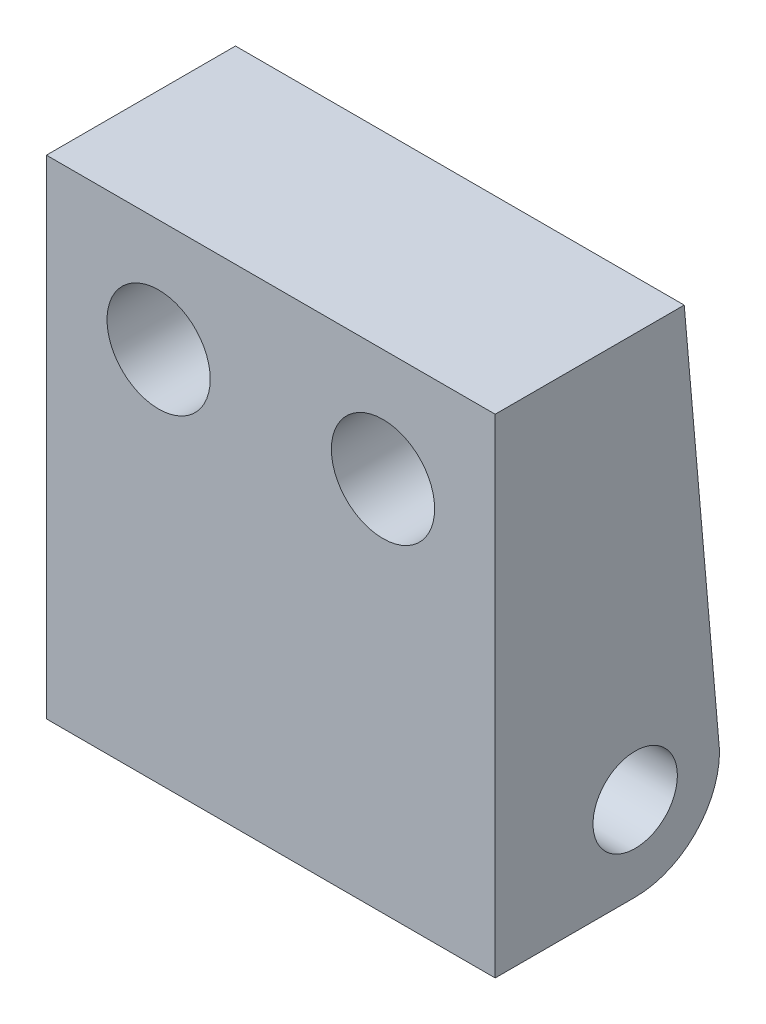
ISO-10303-21;
HEADER;
FILE_DESCRIPTION(('STEP AP214'),'2;1');
FILE_NAME('part.step','',(''),(''),'','','');
FILE_SCHEMA(('AUTOMOTIVE_DESIGN { 1 0 10303 214 1 1 1 1 }'));
ENDSEC;
DATA;
#1=APPLICATION_CONTEXT('core data for automotive mechanical design processes');
#2=APPLICATION_PROTOCOL_DEFINITION('international standard','automotive_design',2000,#1);
#3=PRODUCT_CONTEXT('',#1,'mechanical');
#4=PRODUCT('Part','Part','',(#3));
#5=PRODUCT_RELATED_PRODUCT_CATEGORY('part','',(#4));
#6=PRODUCT_DEFINITION_FORMATION('','',#4);
#7=PRODUCT_DEFINITION_CONTEXT('part definition',#1,'design');
#8=PRODUCT_DEFINITION('design','',#6,#7);
#9=PRODUCT_DEFINITION_SHAPE('','',#8);
#10=(LENGTH_UNIT() NAMED_UNIT(*) SI_UNIT(.MILLI.,.METRE.));
#11=(NAMED_UNIT(*) PLANE_ANGLE_UNIT() SI_UNIT($,.RADIAN.));
#12=(NAMED_UNIT(*) SI_UNIT($,.STERADIAN.) SOLID_ANGLE_UNIT());
#13=UNCERTAINTY_MEASURE_WITH_UNIT(LENGTH_MEASURE(1.E-05),#10,'distance_accuracy_value','');
#14=(GEOMETRIC_REPRESENTATION_CONTEXT(3) GLOBAL_UNCERTAINTY_ASSIGNED_CONTEXT((#13)) GLOBAL_UNIT_ASSIGNED_CONTEXT((#10,
#11,#12)) REPRESENTATION_CONTEXT('',''));
#15=CARTESIAN_POINT('',(0.,0.,0.));
#16=DIRECTION('',(0.,0.,1.));
#17=DIRECTION('',(1.,0.,0.));
#18=AXIS2_PLACEMENT_3D('',#15,#16,#17);
#19=CARTESIAN_POINT('',(0.,0.,6.35));
#20=DIRECTION('',(1.,0.,0.));
#21=DIRECTION('',(0.,0.,-1.));
#22=AXIS2_PLACEMENT_3D('',#19,#20,#21);
#23=PLANE('',#22);
#24=CARTESIAN_POINT('',(0.,2.3876,2.3876));
#25=DIRECTION('',(1.,0.,0.));
#26=DIRECTION('',(0.,0.,-1.));
#27=AXIS2_PLACEMENT_3D('',#24,#25,#26);
#28=CIRCLE('',#27,1.1938);
#29=CARTESIAN_POINT('',(0.,2.3876,1.1938));
#30=VERTEX_POINT('',#29);
#31=EDGE_CURVE('E111',#30,#30,#28,.T.);
#32=ORIENTED_EDGE('',*,*,#31,.T.);
#33=EDGE_LOOP('',(#32));
#34=FACE_BOUND('',#33,.T.);
#35=DIRECTION('',(0.,0.,-1.));
#36=VECTOR('',#35,1.);
#37=CARTESIAN_POINT('',(0.,13.8176,6.35));
#38=LINE('',#37,#36);
#39=CARTESIAN_POINT('',(0.,13.8176,6.35));
#40=VERTEX_POINT('',#39);
#41=CARTESIAN_POINT('',(0.,13.8176,0.999995424101237));
#42=VERTEX_POINT('',#41);
#43=EDGE_CURVE('E99',#40,#42,#38,.T.);
#44=ORIENTED_EDGE('',*,*,#43,.T.);
#45=DIRECTION('',(0.,-0.996194698091746,-0.0871557427476517));
#46=VECTOR('',#45,1.);
#47=CARTESIAN_POINT('',(0.,2.3876,0.));
#48=LINE('',#47,#46);
#49=CARTESIAN_POINT('',(0.,2.3876,0.));
#50=VERTEX_POINT('',#49);
#51=EDGE_CURVE('E83',#42,#50,#48,.T.);
#52=ORIENTED_EDGE('',*,*,#51,.T.);
#53=CARTESIAN_POINT('',(0.,2.3876,2.3876));
#54=DIRECTION('',(-1.,0.,0.));
#55=DIRECTION('',(0.,0.,-1.));
#56=AXIS2_PLACEMENT_3D('',#53,#54,#55);
#57=CIRCLE('',#56,2.3876);
#58=CARTESIAN_POINT('',(0.,0.,2.3876));
#59=VERTEX_POINT('',#58);
#60=EDGE_CURVE('E97',#50,#59,#57,.T.);
#61=ORIENTED_EDGE('',*,*,#60,.T.);
#62=DIRECTION('',(0.,0.,-1.));
#63=VECTOR('',#62,1.);
#64=CARTESIAN_POINT('',(0.,0.,6.35));
#65=LINE('',#64,#63);
#66=CARTESIAN_POINT('',(0.,0.,6.35));
#67=VERTEX_POINT('',#66);
#68=EDGE_CURVE('E11',#67,#59,#65,.T.);
#69=ORIENTED_EDGE('',*,*,#68,.F.);
#70=DIRECTION('',(0.,-1.,0.));
#71=VECTOR('',#70,1.);
#72=CARTESIAN_POINT('',(0.,0.,6.35));
#73=LINE('',#72,#71);
#74=EDGE_CURVE('E114',#40,#67,#73,.T.);
#75=ORIENTED_EDGE('',*,*,#74,.F.);
#76=EDGE_LOOP('',(#44,#52,#61,#69,#75));
#77=FACE_BOUND('',#76,.T.);
#78=ADVANCED_FACE('F33',(#34,#77),#23,.F.);
#79=CARTESIAN_POINT('',(0.,0.,6.35));
#80=DIRECTION('',(0.,1.,0.));
#81=DIRECTION('',(0.,0.,1.));
#82=AXIS2_PLACEMENT_3D('',#79,#80,#81);
#83=PLANE('',#82);
#84=ORIENTED_EDGE('',*,*,#68,.T.);
#85=DIRECTION('',(1.,0.,0.));
#86=VECTOR('',#85,1.);
#87=CARTESIAN_POINT('',(0.,0.,2.3876));
#88=LINE('',#87,#86);
#89=CARTESIAN_POINT('',(12.7,0.,2.3876));
#90=VERTEX_POINT('',#89);
#91=EDGE_CURVE('E91',#59,#90,#88,.T.);
#92=ORIENTED_EDGE('',*,*,#91,.T.);
#93=DIRECTION('',(0.,0.,-1.));
#94=VECTOR('',#93,1.);
#95=CARTESIAN_POINT('',(12.7,0.,6.35));
#96=LINE('',#95,#94);
#97=CARTESIAN_POINT('',(12.7,0.,6.35));
#98=VERTEX_POINT('',#97);
#99=EDGE_CURVE('E41',#98,#90,#96,.T.);
#100=ORIENTED_EDGE('',*,*,#99,.F.);
#101=DIRECTION('',(1.,0.,0.));
#102=VECTOR('',#101,1.);
#103=CARTESIAN_POINT('',(0.,0.,6.35));
#104=LINE('',#103,#102);
#105=EDGE_CURVE('E118',#67,#98,#104,.T.);
#106=ORIENTED_EDGE('',*,*,#105,.F.);
#107=EDGE_LOOP('',(#84,#92,#100,#106));
#108=FACE_BOUND('',#107,.T.);
#109=ADVANCED_FACE('F164',(#108),#83,.F.);
#110=CARTESIAN_POINT('',(12.7,0.,6.35));
#111=DIRECTION('',(-1.,0.,0.));
#112=DIRECTION('',(0.,0.,1.));
#113=AXIS2_PLACEMENT_3D('',#110,#111,#112);
#114=PLANE('',#113);
#115=CARTESIAN_POINT('',(12.7,2.3876,2.3876));
#116=DIRECTION('',(1.,0.,0.));
#117=DIRECTION('',(0.,0.,-1.));
#118=AXIS2_PLACEMENT_3D('',#115,#116,#117);
#119=CIRCLE('',#118,1.1938);
#120=CARTESIAN_POINT('',(12.7,2.3876,1.1938));
#121=VERTEX_POINT('',#120);
#122=EDGE_CURVE('E90',#121,#121,#119,.T.);
#123=ORIENTED_EDGE('',*,*,#122,.F.);
#124=EDGE_LOOP('',(#123));
#125=FACE_BOUND('',#124,.T.);
#126=CARTESIAN_POINT('',(12.7,2.3876,2.3876));
#127=DIRECTION('',(-1.,0.,0.));
#128=DIRECTION('',(0.,0.,-1.));
#129=AXIS2_PLACEMENT_3D('',#126,#127,#128);
#130=CIRCLE('',#129,2.3876);
#131=CARTESIAN_POINT('',(12.7,2.3876,0.));
#132=VERTEX_POINT('',#131);
#133=EDGE_CURVE('E104',#132,#90,#130,.T.);
#134=ORIENTED_EDGE('',*,*,#133,.F.);
#135=DIRECTION('',(0.,-0.996194698091746,-0.0871557427476517));
#136=VECTOR('',#135,1.);
#137=CARTESIAN_POINT('',(12.7,2.3876,0.));
#138=LINE('',#137,#136);
#139=CARTESIAN_POINT('',(12.7,13.8176,0.999995424101237));
#140=VERTEX_POINT('',#139);
#141=EDGE_CURVE('E86',#140,#132,#138,.T.);
#142=ORIENTED_EDGE('',*,*,#141,.F.);
#143=DIRECTION('',(0.,0.,-1.));
#144=VECTOR('',#143,1.);
#145=CARTESIAN_POINT('',(12.7,13.8176,6.35));
#146=LINE('',#145,#144);
#147=CARTESIAN_POINT('',(12.7,13.8176,6.35));
#148=VERTEX_POINT('',#147);
#149=EDGE_CURVE('E123',#148,#140,#146,.T.);
#150=ORIENTED_EDGE('',*,*,#149,.F.);
#151=DIRECTION('',(0.,1.,0.));
#152=VECTOR('',#151,1.);
#153=CARTESIAN_POINT('',(12.7,0.,6.35));
#154=LINE('',#153,#152);
#155=EDGE_CURVE('E54',#98,#148,#154,.T.);
#156=ORIENTED_EDGE('',*,*,#155,.F.);
#157=ORIENTED_EDGE('',*,*,#99,.T.);
#158=EDGE_LOOP('',(#134,#142,#150,#156,#157));
#159=FACE_BOUND('',#158,.T.);
#160=ADVANCED_FACE('F166',(#125,#159),#114,.F.);
#161=CARTESIAN_POINT('',(0.,13.8176,6.35));
#162=DIRECTION('',(0.,-1.,0.));
#163=DIRECTION('',(0.,0.,-1.));
#164=AXIS2_PLACEMENT_3D('',#161,#162,#163);
#165=PLANE('',#164);
#166=ORIENTED_EDGE('',*,*,#149,.T.);
#167=DIRECTION('',(-1.,0.,0.));
#168=VECTOR('',#167,1.);
#169=CARTESIAN_POINT('',(0.,13.8176,0.999995424101236));
#170=LINE('',#169,#168);
#171=EDGE_CURVE('E100',#140,#42,#170,.T.);
#172=ORIENTED_EDGE('',*,*,#171,.T.);
#173=ORIENTED_EDGE('',*,*,#43,.F.);
#174=DIRECTION('',(-1.,0.,0.));
#175=VECTOR('',#174,1.);
#176=CARTESIAN_POINT('',(0.,13.8176,6.35));
#177=LINE('',#176,#175);
#178=EDGE_CURVE('E49',#148,#40,#177,.T.);
#179=ORIENTED_EDGE('',*,*,#178,.F.);
#180=EDGE_LOOP('',(#166,#172,#173,#179));
#181=FACE_BOUND('',#180,.T.);
#182=ADVANCED_FACE('F159',(#181),#165,.F.);
#183=CARTESIAN_POINT('',(0.,0.,6.35));
#184=DIRECTION('',(0.,0.,-1.));
#185=DIRECTION('',(-1.,0.,0.));
#186=AXIS2_PLACEMENT_3D('',#183,#184,#185);
#187=PLANE('',#186);
#188=CARTESIAN_POINT('',(9.525,10.6426,6.35));
#189=DIRECTION('',(0.,0.,1.));
#190=DIRECTION('',(-1.,0.,0.));
#191=AXIS2_PLACEMENT_3D('',#188,#189,#190);
#192=CIRCLE('',#191,1.4605);
#193=CARTESIAN_POINT('',(8.0645,10.6426,6.35));
#194=VERTEX_POINT('',#193);
#195=EDGE_CURVE('E134',#194,#194,#192,.T.);
#196=ORIENTED_EDGE('',*,*,#195,.F.);
#197=EDGE_LOOP('',(#196));
#198=FACE_BOUND('',#197,.T.);
#199=CARTESIAN_POINT('',(3.175,10.6426,6.35));
#200=DIRECTION('',(0.,0.,1.));
#201=DIRECTION('',(1.,0.,0.));
#202=AXIS2_PLACEMENT_3D('',#199,#200,#201);
#203=CIRCLE('',#202,1.4605);
#204=CARTESIAN_POINT('',(4.6355,10.6426,6.35));
#205=VERTEX_POINT('',#204);
#206=EDGE_CURVE('E150',#205,#205,#203,.T.);
#207=ORIENTED_EDGE('',*,*,#206,.F.);
#208=EDGE_LOOP('',(#207));
#209=FACE_BOUND('',#208,.T.);
#210=ORIENTED_EDGE('',*,*,#74,.T.);
#211=ORIENTED_EDGE('',*,*,#105,.T.);
#212=ORIENTED_EDGE('',*,*,#155,.T.);
#213=ORIENTED_EDGE('',*,*,#178,.T.);
#214=EDGE_LOOP('',(#210,#211,#212,#213));
#215=FACE_BOUND('',#214,.T.);
#216=ADVANCED_FACE('F156',(#198,#209,#215),#187,.F.);
#217=CARTESIAN_POINT('',(0.,2.3876,2.3876));
#218=DIRECTION('',(1.,0.,0.));
#219=DIRECTION('',(0.,0.,-1.));
#220=AXIS2_PLACEMENT_3D('',#217,#218,#219);
#221=CYLINDRICAL_SURFACE('',#220,1.1938);
#222=ORIENTED_EDGE('',*,*,#31,.F.);
#223=EDGE_LOOP('',(#222));
#224=FACE_BOUND('',#223,.T.);
#225=ORIENTED_EDGE('',*,*,#122,.T.);
#226=EDGE_LOOP('',(#225));
#227=FACE_BOUND('',#226,.T.);
#228=ADVANCED_FACE('F158',(#224,#227),#221,.F.);
#229=CARTESIAN_POINT('',(0.,2.3876,2.3876));
#230=DIRECTION('',(1.,0.,0.));
#231=DIRECTION('',(0.,0.,-1.));
#232=AXIS2_PLACEMENT_3D('',#229,#230,#231);
#233=CYLINDRICAL_SURFACE('',#232,2.3876);
#234=ORIENTED_EDGE('',*,*,#133,.T.);
#235=ORIENTED_EDGE('',*,*,#91,.F.);
#236=ORIENTED_EDGE('',*,*,#60,.F.);
#237=DIRECTION('',(1.,0.,0.));
#238=VECTOR('',#237,1.);
#239=CARTESIAN_POINT('',(0.,2.3876,0.));
#240=LINE('',#239,#238);
#241=EDGE_CURVE('E80',#50,#132,#240,.T.);
#242=ORIENTED_EDGE('',*,*,#241,.T.);
#243=EDGE_LOOP('',(#234,#235,#236,#242));
#244=FACE_BOUND('',#243,.T.);
#245=ADVANCED_FACE('F102',(#244),#233,.T.);
#246=CARTESIAN_POINT('',(0.,2.3876,0.));
#247=DIRECTION('',(0.,-0.0871557427476517,0.996194698091746));
#248=DIRECTION('',(0.,-0.996194698091746,-0.0871557427476517));
#249=AXIS2_PLACEMENT_3D('',#246,#247,#248);
#250=PLANE('',#249);
#251=CARTESIAN_POINT('',(9.525,10.6426,0.722218917406449));
#252=DIRECTION('',(0.,-0.0871557427476517,0.996194698091746));
#253=DIRECTION('',(0.,0.996194698091746,0.0871557427476517));
#254=AXIS2_PLACEMENT_3D('',#251,#252,#253);
#255=ELLIPSE('',#254,2.79192411415931,2.7813);
#256=CARTESIAN_POINT('',(9.525,13.4239,0.965551137271083));
#257=VERTEX_POINT('',#256);
#258=EDGE_CURVE('E36',#257,#257,#255,.T.);
#259=ORIENTED_EDGE('',*,*,#258,.T.);
#260=EDGE_LOOP('',(#259));
#261=FACE_BOUND('',#260,.T.);
#262=CARTESIAN_POINT('',(3.175,10.6426,0.722218917406449));
#263=DIRECTION('',(0.,-0.0871557427476517,0.996194698091746));
#264=DIRECTION('',(0.,0.996194698091746,0.0871557427476517));
#265=AXIS2_PLACEMENT_3D('',#262,#263,#264);
#266=ELLIPSE('',#265,2.79192411415931,2.7813);
#267=CARTESIAN_POINT('',(3.175,13.4239,0.965551137271083));
#268=VERTEX_POINT('',#267);
#269=EDGE_CURVE('E131',#268,#268,#266,.T.);
#270=ORIENTED_EDGE('',*,*,#269,.T.);
#271=EDGE_LOOP('',(#270));
#272=FACE_BOUND('',#271,.T.);
#273=ORIENTED_EDGE('',*,*,#141,.T.);
#274=ORIENTED_EDGE('',*,*,#241,.F.);
#275=ORIENTED_EDGE('',*,*,#51,.F.);
#276=ORIENTED_EDGE('',*,*,#171,.F.);
#277=EDGE_LOOP('',(#273,#274,#275,#276));
#278=FACE_BOUND('',#277,.T.);
#279=ADVANCED_FACE('F82',(#261,#272,#278),#250,.F.);
#280=CARTESIAN_POINT('',(3.175,10.6426,0.));
#281=DIRECTION('',(0.,0.,1.));
#282=DIRECTION('',(1.,0.,0.));
#283=AXIS2_PLACEMENT_3D('',#280,#281,#282);
#284=CYLINDRICAL_SURFACE('',#283,1.4605);
#285=CARTESIAN_POINT('',(3.175,10.6426,1.27));
#286=DIRECTION('',(0.,0.,1.));
#287=DIRECTION('',(1.,0.,0.));
#288=AXIS2_PLACEMENT_3D('',#285,#286,#287);
#289=CIRCLE('',#288,1.4605);
#290=CARTESIAN_POINT('',(4.6355,10.6426,1.27));
#291=VERTEX_POINT('',#290);
#292=EDGE_CURVE('E128',#291,#291,#289,.F.);
#293=ORIENTED_EDGE('',*,*,#292,.T.);
#294=EDGE_LOOP('',(#293));
#295=FACE_BOUND('',#294,.T.);
#296=ORIENTED_EDGE('',*,*,#206,.T.);
#297=EDGE_LOOP('',(#296));
#298=FACE_BOUND('',#297,.T.);
#299=ADVANCED_FACE('F154',(#295,#298),#284,.F.);
#300=CARTESIAN_POINT('',(9.525,10.6426,0.));
#301=DIRECTION('',(0.,0.,1.));
#302=DIRECTION('',(1.,0.,0.));
#303=AXIS2_PLACEMENT_3D('',#300,#301,#302);
#304=CYLINDRICAL_SURFACE('',#303,1.4605);
#305=CARTESIAN_POINT('',(9.525,10.6426,1.27));
#306=DIRECTION('',(0.,0.,1.));
#307=DIRECTION('',(1.,0.,0.));
#308=AXIS2_PLACEMENT_3D('',#305,#306,#307);
#309=CIRCLE('',#308,1.4605);
#310=CARTESIAN_POINT('',(10.9855,10.6426,1.27));
#311=VERTEX_POINT('',#310);
#312=EDGE_CURVE('E135',#311,#311,#309,.F.);
#313=ORIENTED_EDGE('',*,*,#312,.T.);
#314=EDGE_LOOP('',(#313));
#315=FACE_BOUND('',#314,.T.);
#316=ORIENTED_EDGE('',*,*,#195,.T.);
#317=EDGE_LOOP('',(#316));
#318=FACE_BOUND('',#317,.T.);
#319=ADVANCED_FACE('F196',(#315,#318),#304,.F.);
#320=CARTESIAN_POINT('',(3.175,10.6426,0.));
#321=DIRECTION('',(0.,0.,1.));
#322=DIRECTION('',(1.,0.,0.));
#323=AXIS2_PLACEMENT_3D('',#320,#321,#322);
#324=CYLINDRICAL_SURFACE('',#323,2.7813);
#325=CARTESIAN_POINT('',(3.175,10.6426,1.27));
#326=DIRECTION('',(0.,0.,1.));
#327=DIRECTION('',(1.,0.,0.));
#328=AXIS2_PLACEMENT_3D('',#325,#326,#327);
#329=CIRCLE('',#328,2.7813);
#330=CARTESIAN_POINT('',(5.9563,10.6426,1.27));
#331=VERTEX_POINT('',#330);
#332=EDGE_CURVE('E132',#331,#331,#329,.T.);
#333=ORIENTED_EDGE('',*,*,#332,.T.);
#334=EDGE_LOOP('',(#333));
#335=FACE_BOUND('',#334,.T.);
#336=ORIENTED_EDGE('',*,*,#269,.F.);
#337=EDGE_LOOP('',(#336));
#338=FACE_BOUND('',#337,.T.);
#339=ADVANCED_FACE('F200',(#335,#338),#324,.F.);
#340=CARTESIAN_POINT('',(3.175,10.6426,1.27));
#341=DIRECTION('',(0.,0.,1.));
#342=DIRECTION('',(1.,0.,0.));
#343=AXIS2_PLACEMENT_3D('',#340,#341,#342);
#344=PLANE('',#343);
#345=ORIENTED_EDGE('',*,*,#332,.F.);
#346=EDGE_LOOP('',(#345));
#347=FACE_BOUND('',#346,.T.);
#348=ORIENTED_EDGE('',*,*,#292,.F.);
#349=EDGE_LOOP('',(#348));
#350=FACE_BOUND('',#349,.T.);
#351=ADVANCED_FACE('F203',(#347,#350),#344,.F.);
#352=CARTESIAN_POINT('',(9.525,10.6426,0.));
#353=DIRECTION('',(0.,0.,1.));
#354=DIRECTION('',(1.,0.,0.));
#355=AXIS2_PLACEMENT_3D('',#352,#353,#354);
#356=CYLINDRICAL_SURFACE('',#355,2.7813);
#357=CARTESIAN_POINT('',(9.525,10.6426,1.27));
#358=DIRECTION('',(0.,0.,1.));
#359=DIRECTION('',(1.,0.,0.));
#360=AXIS2_PLACEMENT_3D('',#357,#358,#359);
#361=CIRCLE('',#360,2.7813);
#362=CARTESIAN_POINT('',(12.3063,10.6426,1.27));
#363=VERTEX_POINT('',#362);
#364=EDGE_CURVE('E137',#363,#363,#361,.T.);
#365=ORIENTED_EDGE('',*,*,#364,.T.);
#366=EDGE_LOOP('',(#365));
#367=FACE_BOUND('',#366,.T.);
#368=ORIENTED_EDGE('',*,*,#258,.F.);
#369=EDGE_LOOP('',(#368));
#370=FACE_BOUND('',#369,.T.);
#371=ADVANCED_FACE('F207',(#367,#370),#356,.F.);
#372=CARTESIAN_POINT('',(9.525,10.6426,1.27));
#373=DIRECTION('',(0.,0.,1.));
#374=DIRECTION('',(1.,0.,0.));
#375=AXIS2_PLACEMENT_3D('',#372,#373,#374);
#376=PLANE('',#375);
#377=ORIENTED_EDGE('',*,*,#364,.F.);
#378=EDGE_LOOP('',(#377));
#379=FACE_BOUND('',#378,.T.);
#380=ORIENTED_EDGE('',*,*,#312,.F.);
#381=EDGE_LOOP('',(#380));
#382=FACE_BOUND('',#381,.T.);
#383=ADVANCED_FACE('F211',(#379,#382),#376,.F.);
#384=CLOSED_SHELL('',(#78,#109,#160,#182,#216,#228,#245,#279,#299,#319,#339,#351,#371,#383));
#385=MANIFOLD_SOLID_BREP('B2',#384);
#386=ADVANCED_BREP_SHAPE_REPRESENTATION('',(#18,#385),#14);
#387=SHAPE_DEFINITION_REPRESENTATION(#9,#386);
ENDSEC;
END-ISO-10303-21;
